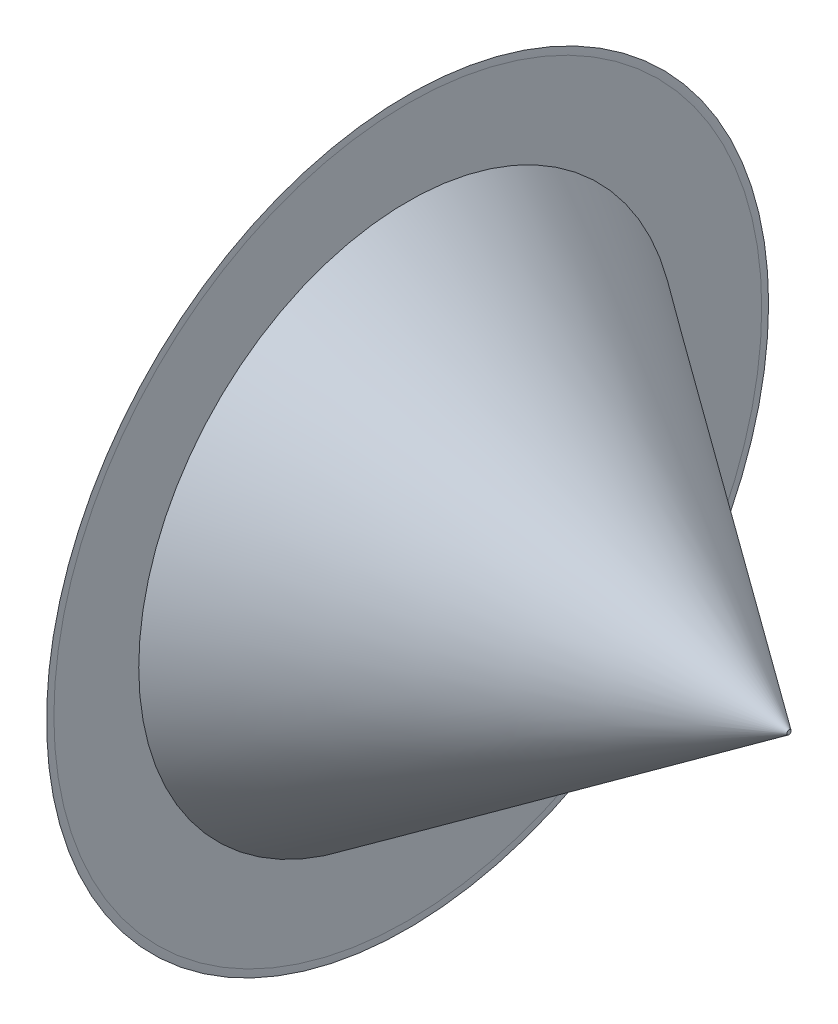
ISO-10303-21;
HEADER;
FILE_DESCRIPTION(('STEP AP214'),'2;1');
FILE_NAME('part.step','',(''),(''),'','','');
FILE_SCHEMA(('AUTOMOTIVE_DESIGN { 1 0 10303 214 1 1 1 1 }'));
ENDSEC;
DATA;
#1=APPLICATION_CONTEXT('core data for automotive mechanical design processes');
#2=APPLICATION_PROTOCOL_DEFINITION('international standard','automotive_design',2000,#1);
#3=PRODUCT_CONTEXT('',#1,'mechanical');
#4=PRODUCT('Part','Part','',(#3));
#5=PRODUCT_RELATED_PRODUCT_CATEGORY('part','',(#4));
#6=PRODUCT_DEFINITION_FORMATION('','',#4);
#7=PRODUCT_DEFINITION_CONTEXT('part definition',#1,'design');
#8=PRODUCT_DEFINITION('design','',#6,#7);
#9=PRODUCT_DEFINITION_SHAPE('','',#8);
#10=(LENGTH_UNIT() NAMED_UNIT(*) SI_UNIT(.MILLI.,.METRE.));
#11=(NAMED_UNIT(*) PLANE_ANGLE_UNIT() SI_UNIT($,.RADIAN.));
#12=(NAMED_UNIT(*) SI_UNIT($,.STERADIAN.) SOLID_ANGLE_UNIT());
#13=UNCERTAINTY_MEASURE_WITH_UNIT(LENGTH_MEASURE(1.E-05),#10,'distance_accuracy_value','');
#14=(GEOMETRIC_REPRESENTATION_CONTEXT(3) GLOBAL_UNCERTAINTY_ASSIGNED_CONTEXT((#13)) GLOBAL_UNIT_ASSIGNED_CONTEXT((#10,
#11,#12)) REPRESENTATION_CONTEXT('',''));
#15=CARTESIAN_POINT('',(0.,0.,0.));
#16=DIRECTION('',(0.,0.,1.));
#17=DIRECTION('',(1.,0.,0.));
#18=AXIS2_PLACEMENT_3D('',#15,#16,#17);
#19=CARTESIAN_POINT('',(0.01,0.,0.));
#20=DIRECTION('',(1.,0.,0.));
#21=DIRECTION('',(0.,0.,-1.));
#22=AXIS2_PLACEMENT_3D('',#19,#20,#21);
#23=PLANE('',#22);
#24=CARTESIAN_POINT('',(0.01,0.,0.));
#25=DIRECTION('',(1.,0.,0.));
#26=DIRECTION('',(0.,0.,-1.));
#27=AXIS2_PLACEMENT_3D('',#24,#25,#26);
#28=CIRCLE('',#27,12.);
#29=CARTESIAN_POINT('',(0.00999999999999959,0.,12.));
#30=VERTEX_POINT('',#29);
#31=EDGE_CURVE('E48',#30,#30,#28,.T.);
#32=ORIENTED_EDGE('',*,*,#31,.F.);
#33=EDGE_LOOP('',(#32));
#34=FACE_BOUND('',#33,.T.);
#35=CARTESIAN_POINT('',(0.00999999999999959,0.,0.));
#36=DIRECTION('',(1.,0.,0.));
#37=DIRECTION('',(0.,0.,-1.));
#38=AXIS2_PLACEMENT_3D('',#35,#36,#37);
#39=CIRCLE('',#38,15.7839303874144);
#40=CARTESIAN_POINT('',(0.00999999999999959,0.,-15.7839303874144));
#41=VERTEX_POINT('',#40);
#42=EDGE_CURVE('E40',#41,#41,#39,.T.);
#43=ORIENTED_EDGE('',*,*,#42,.T.);
#44=EDGE_LOOP('',(#43));
#45=FACE_BOUND('',#44,.T.);
#46=ADVANCED_FACE('F33',(#34,#45),#23,.T.);
#47=CARTESIAN_POINT('',(0.,0.,0.));
#48=DIRECTION('',(1.,0.,0.));
#49=DIRECTION('',(0.,0.,-1.));
#50=AXIS2_PLACEMENT_3D('',#47,#48,#49);
#51=PLANE('',#50);
#52=CARTESIAN_POINT('',(0.,0.,0.));
#53=DIRECTION('',(1.,0.,0.));
#54=DIRECTION('',(0.,0.,-1.));
#55=AXIS2_PLACEMENT_3D('',#52,#53,#54);
#56=CIRCLE('',#55,16.1);
#57=CARTESIAN_POINT('',(0.,0.,-16.1));
#58=VERTEX_POINT('',#57);
#59=EDGE_CURVE('E44',#58,#58,#56,.T.);
#60=ORIENTED_EDGE('',*,*,#59,.F.);
#61=EDGE_LOOP('',(#60));
#62=FACE_BOUND('',#61,.T.);
#63=ADVANCED_FACE('F57',(#62),#51,.F.);
#64=CARTESIAN_POINT('',(-4.99,0.,0.));
#65=DIRECTION('',(-1.,0.,0.));
#66=DIRECTION('',(0.,0.,1.));
#67=AXIS2_PLACEMENT_3D('',#64,#65,#66);
#68=TOROIDAL_SURFACE('',#67,15.7839303874144,5.);
#69=ORIENTED_EDGE('',*,*,#59,.T.);
#70=EDGE_LOOP('',(#69));
#71=FACE_BOUND('',#70,.T.);
#72=ORIENTED_EDGE('',*,*,#42,.F.);
#73=EDGE_LOOP('',(#72));
#74=FACE_BOUND('',#73,.T.);
#75=ADVANCED_FACE('F62',(#71,#74),#68,.T.);
#76=CARTESIAN_POINT('',(17.01,0.,0.));
#77=DIRECTION('',(1.,0.,0.));
#78=DIRECTION('',(0.,0.,-1.));
#79=AXIS2_PLACEMENT_3D('',#76,#77,#78);
#80=PLANE('',#79);
#81=CARTESIAN_POINT('',(17.01,0.,0.));
#82=DIRECTION('',(1.,0.,0.));
#83=DIRECTION('',(0.,0.,-1.));
#84=AXIS2_PLACEMENT_3D('',#81,#82,#83);
#85=CIRCLE('',#84,0.0964718504349454);
#86=CARTESIAN_POINT('',(17.01,0.,0.0964718504349467));
#87=VERTEX_POINT('',#86);
#88=EDGE_CURVE('E10',#87,#87,#85,.T.);
#89=ORIENTED_EDGE('',*,*,#88,.T.);
#90=EDGE_LOOP('',(#89));
#91=FACE_BOUND('',#90,.T.);
#92=ADVANCED_FACE('F66',(#91),#80,.T.);
#93=CARTESIAN_POINT('',(17.01,0.,0.));
#94=DIRECTION('',(-1.,0.,0.));
#95=DIRECTION('',(0.,0.,1.));
#96=AXIS2_PLACEMENT_3D('',#93,#94,#95);
#97=CONICAL_SURFACE('',#96,0.0964718504349454,0.610865238198013);
#98=CARTESIAN_POINT('',(0.00999999999999959,0.,12.));
#99=CARTESIAN_POINT('',(0.187083333333333,0.,11.8760049151087));
#100=CARTESIAN_POINT('',(0.364166666666667,0.,11.7520098302174));
#101=CARTESIAN_POINT('',(0.718333333333333,0.,11.5040196604347));
#102=CARTESIAN_POINT('',(0.895416666666667,0.,11.3800245755434));
#103=CARTESIAN_POINT('',(1.24958333333333,0.,11.1320344057608));
#104=CARTESIAN_POINT('',(1.42666666666667,0.,11.0080393208695));
#105=CARTESIAN_POINT('',(1.78083333333333,0.,10.7600491510869));
#106=CARTESIAN_POINT('',(1.95791666666667,0.,10.6360540661956));
#107=CARTESIAN_POINT('',(2.31208333333333,0.,10.388063896413));
#108=CARTESIAN_POINT('',(2.48916666666667,0.,10.2640688115217));
#109=CARTESIAN_POINT('',(2.84333333333333,0.,10.0160786417391));
#110=CARTESIAN_POINT('',(3.02041666666667,0.,9.89208355684782));
#111=CARTESIAN_POINT('',(3.37458333333333,0.,9.64409338706522));
#112=CARTESIAN_POINT('',(3.55166666666667,0.,9.52009830217391));
#113=CARTESIAN_POINT('',(3.90583333333333,0.,9.27210813239131));
#114=CARTESIAN_POINT('',(4.08291666666667,0.,9.1481130475));
#115=CARTESIAN_POINT('',(4.43708333333333,0.,8.9001228777174));
#116=CARTESIAN_POINT('',(4.61416666666667,0.,8.7761277928261));
#117=CARTESIAN_POINT('',(4.96833333333333,0.,8.5281376230435));
#118=CARTESIAN_POINT('',(5.14541666666666,0.,8.40414253815219));
#119=CARTESIAN_POINT('',(5.49958333333333,0.,8.15615236836959));
#120=CARTESIAN_POINT('',(5.67666666666666,0.,8.03215728347829));
#121=CARTESIAN_POINT('',(6.03083333333333,0.,7.78416711369568));
#122=CARTESIAN_POINT('',(6.20791666666666,0.,7.66017202880438));
#123=CARTESIAN_POINT('',(6.56208333333333,0.,7.41218185902177));
#124=CARTESIAN_POINT('',(6.73916666666666,0.,7.28818677413047));
#125=CARTESIAN_POINT('',(7.09333333333333,0.,7.04019660434787));
#126=CARTESIAN_POINT('',(7.27041666666667,0.,6.91620151945657));
#127=CARTESIAN_POINT('',(7.62458333333333,0.,6.66821134967396));
#128=CARTESIAN_POINT('',(7.80166666666666,0.,6.54421626478266));
#129=CARTESIAN_POINT('',(8.15583333333333,0.,6.29622609500006));
#130=CARTESIAN_POINT('',(8.33291666666667,0.,6.17223101010875));
#131=CARTESIAN_POINT('',(8.68708333333333,0.,5.92424084032615));
#132=CARTESIAN_POINT('',(8.86416666666667,0.,5.80024575543485));
#133=CARTESIAN_POINT('',(9.21833333333333,0.,5.55225558565224));
#134=CARTESIAN_POINT('',(9.39541666666666,0.,5.42826050076094));
#135=CARTESIAN_POINT('',(9.74958333333333,0.,5.18027033097834));
#136=CARTESIAN_POINT('',(9.92666666666667,0.,5.05627524608703));
#137=CARTESIAN_POINT('',(10.2808333333333,0.,4.80828507630443));
#138=CARTESIAN_POINT('',(10.4579166666667,0.,4.68428999141313));
#139=CARTESIAN_POINT('',(10.8120833333333,0.,4.43629982163052));
#140=CARTESIAN_POINT('',(10.9891666666667,0.,4.31230473673922));
#141=CARTESIAN_POINT('',(11.3433333333333,0.,4.06431456695662));
#142=CARTESIAN_POINT('',(11.5204166666667,0.,3.94031948206531));
#143=CARTESIAN_POINT('',(11.8745833333333,0.,3.69232931228271));
#144=CARTESIAN_POINT('',(12.0516666666667,0.,3.56833422739141));
#145=CARTESIAN_POINT('',(12.4058333333333,0.,3.3203440576088));
#146=CARTESIAN_POINT('',(12.5829166666667,0.,3.1963489727175));
#147=CARTESIAN_POINT('',(12.9370833333333,0.,2.9483588029349));
#148=CARTESIAN_POINT('',(13.1141666666667,0.,2.8243637180436));
#149=CARTESIAN_POINT('',(13.4683333333333,0.,2.57637354826099));
#150=CARTESIAN_POINT('',(13.6454166666667,0.,2.45237846336969));
#151=CARTESIAN_POINT('',(13.9995833333333,0.,2.20438829358708));
#152=CARTESIAN_POINT('',(14.1766666666667,0.,2.08039320869578));
#153=CARTESIAN_POINT('',(14.5308333333333,0.,1.83240303891318));
#154=CARTESIAN_POINT('',(14.7079166666667,0.,1.70840795402188));
#155=CARTESIAN_POINT('',(15.0620833333333,0.,1.46041778423927));
#156=CARTESIAN_POINT('',(15.2391666666667,0.,1.33642269934797));
#157=CARTESIAN_POINT('',(15.5933333333333,0.,1.08843252956537));
#158=CARTESIAN_POINT('',(15.7704166666667,0.,0.964437444674063));
#159=CARTESIAN_POINT('',(16.1245833333333,0.,0.716447274891459));
#160=CARTESIAN_POINT('',(16.3016666666667,0.,0.592452190000157));
#161=CARTESIAN_POINT('',(16.6558333333333,0.,0.344462020217552));
#162=CARTESIAN_POINT('',(16.8329166666667,0.,0.22046693532625));
#163=CARTESIAN_POINT('',(17.01,0.,0.0964718504349479));
#164=B_SPLINE_CURVE_WITH_KNOTS('',3,(#98,#99,#100,#101,#102,#103,#104,#105,#106,#107,#108,#109,
#110,#111,#112,#113,#114,#115,#116,#117,#118,#119,#120,#121,#122,#123,#124,#125,#126,#127,#128,
#129,#130,#131,#132,#133,#134,#135,#136,#137,#138,#139,#140,#141,#142,#143,#144,#145,#146,#147,
#148,#149,#150,#151,#152,#153,#154,#155,#156,#157,#158,#159,#160,#161,#162,#163),.UNSPECIFIED.,
.F.,.F.,(4,2,2,2,2,2,2,2,2,2,2,2,2,2,2,2,2,2,2,2,2,2,2,2,2,2,2,2,2,2,2,2,4),(0.,
0.648536500279523,1.29707300055905,1.94560950083857,2.59414600111809,3.24268250139761,
3.89121900167713,4.53975550195666,5.18829200223618,5.8368285025157,6.48536500279523,
7.13390150307475,7.78243800335427,8.43097450363379,9.07951100391331,9.72804750419284,
10.3765840044724,11.0251205047519,11.6736570050314,12.3221935053109,12.9707300055904,
13.61926650587,14.2678030061495,14.916339506429,15.5648760067085,16.2134125069881,
16.8619490072676,17.5104855075471,18.1590220078266,18.8075585081062,19.4560950083857,
20.1046315086652,20.7531680089447),.UNSPECIFIED.);
#165=EDGE_CURVE('BSEAM35',#30,#87,#164,.T.);
#166=ORIENTED_EDGE('',*,*,#31,.T.);
#167=ORIENTED_EDGE('',*,*,#88,.F.);
#168=ORIENTED_EDGE('',*,*,#165,.T.);
#169=ORIENTED_EDGE('',*,*,#165,.F.);
#170=EDGE_LOOP('',(#166,#168,#167,#169));
#171=FACE_BOUND('',#170,.T.);
#172=ADVANCED_FACE('F35',(#171),#97,.T.);
#173=CLOSED_SHELL('',(#46,#63,#75,#92,#172));
#174=MANIFOLD_SOLID_BREP('B2',#173);
#175=ADVANCED_BREP_SHAPE_REPRESENTATION('',(#18,#174),#14);
#176=SHAPE_DEFINITION_REPRESENTATION(#9,#175);
ENDSEC;
END-ISO-10303-21;
